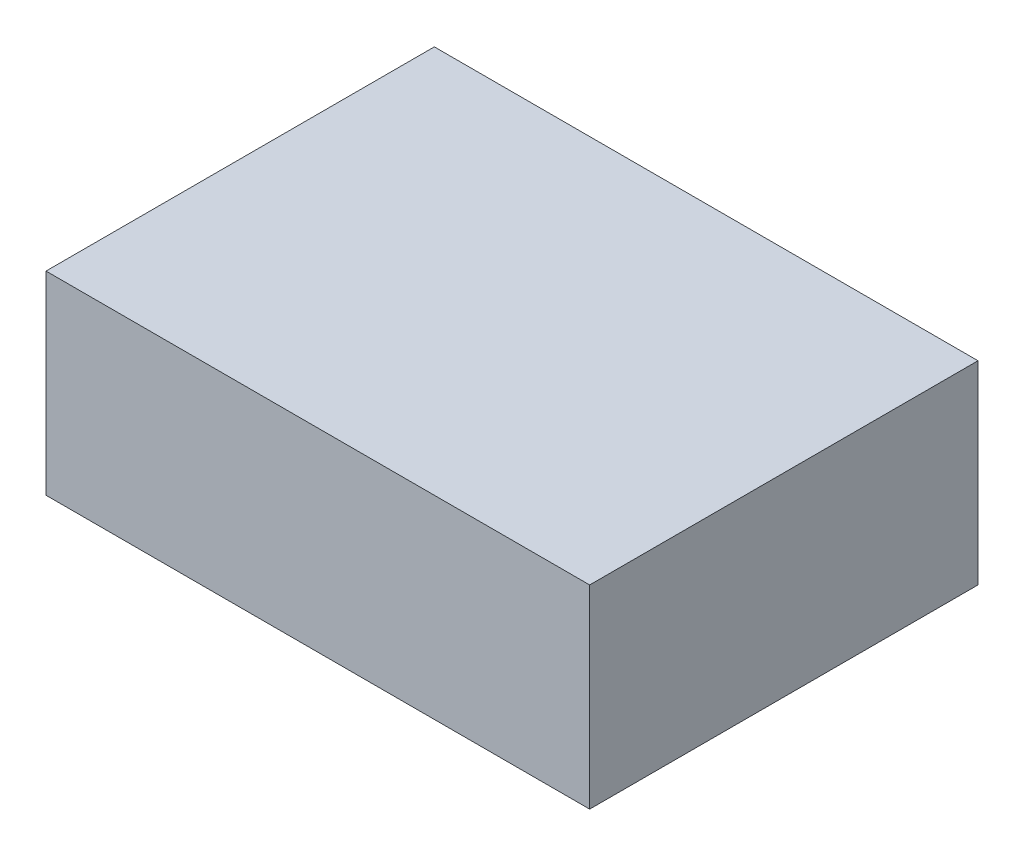
ISO-10303-21;
HEADER;
FILE_DESCRIPTION(('STEP AP214'),'2;1');
FILE_NAME('part.step','',(''),(''),'','','');
FILE_SCHEMA(('AUTOMOTIVE_DESIGN { 1 0 10303 214 1 1 1 1 }'));
ENDSEC;
DATA;
#1=APPLICATION_CONTEXT('core data for automotive mechanical design processes');
#2=APPLICATION_PROTOCOL_DEFINITION('international standard','automotive_design',2000,#1);
#3=PRODUCT_CONTEXT('',#1,'mechanical');
#4=PRODUCT('Part','Part','',(#3));
#5=PRODUCT_RELATED_PRODUCT_CATEGORY('part','',(#4));
#6=PRODUCT_DEFINITION_FORMATION('','',#4);
#7=PRODUCT_DEFINITION_CONTEXT('part definition',#1,'design');
#8=PRODUCT_DEFINITION('design','',#6,#7);
#9=PRODUCT_DEFINITION_SHAPE('','',#8);
#10=(LENGTH_UNIT() NAMED_UNIT(*) SI_UNIT(.MILLI.,.METRE.));
#11=(NAMED_UNIT(*) PLANE_ANGLE_UNIT() SI_UNIT($,.RADIAN.));
#12=(NAMED_UNIT(*) SI_UNIT($,.STERADIAN.) SOLID_ANGLE_UNIT());
#13=UNCERTAINTY_MEASURE_WITH_UNIT(LENGTH_MEASURE(1.E-05),#10,'distance_accuracy_value','');
#14=(GEOMETRIC_REPRESENTATION_CONTEXT(3) GLOBAL_UNCERTAINTY_ASSIGNED_CONTEXT((#13)) GLOBAL_UNIT_ASSIGNED_CONTEXT((#10,
#11,#12)) REPRESENTATION_CONTEXT('',''));
#15=CARTESIAN_POINT('',(0.,0.,0.));
#16=DIRECTION('',(0.,0.,1.));
#17=DIRECTION('',(1.,0.,0.));
#18=AXIS2_PLACEMENT_3D('',#15,#16,#17);
#19=CARTESIAN_POINT('',(127.,104.,-115.));
#20=DIRECTION('',(0.,1.,0.));
#21=DIRECTION('',(0.,0.,-1.));
#22=AXIS2_PLACEMENT_3D('',#19,#20,#21);
#23=PLANE('',#22);
#24=DIRECTION('',(1.,0.,0.));
#25=VECTOR('',#24,1.);
#26=CARTESIAN_POINT('',(92.,104.,-90.));
#27=LINE('',#26,#25);
#28=CARTESIAN_POINT('',(92.,104.,-90.));
#29=VERTEX_POINT('',#28);
#30=CARTESIAN_POINT('',(162.,104.,-90.));
#31=VERTEX_POINT('',#30);
#32=EDGE_CURVE('E89',#29,#31,#27,.T.);
#33=ORIENTED_EDGE('',*,*,#32,.T.);
#34=DIRECTION('',(0.,0.,-1.));
#35=VECTOR('',#34,1.);
#36=CARTESIAN_POINT('',(162.,104.,-90.));
#37=LINE('',#36,#35);
#38=CARTESIAN_POINT('',(162.,104.,-140.));
#39=VERTEX_POINT('',#38);
#40=EDGE_CURVE('E69',#31,#39,#37,.T.);
#41=ORIENTED_EDGE('',*,*,#40,.T.);
#42=DIRECTION('',(-1.,0.,0.));
#43=VECTOR('',#42,1.);
#44=CARTESIAN_POINT('',(162.,104.,-140.));
#45=LINE('',#44,#43);
#46=CARTESIAN_POINT('',(92.,104.,-140.));
#47=VERTEX_POINT('',#46);
#48=EDGE_CURVE('E74',#39,#47,#45,.T.);
#49=ORIENTED_EDGE('',*,*,#48,.T.);
#50=DIRECTION('',(0.,0.,1.));
#51=VECTOR('',#50,1.);
#52=CARTESIAN_POINT('',(92.,104.,-140.));
#53=LINE('',#52,#51);
#54=EDGE_CURVE('E11',#47,#29,#53,.T.);
#55=ORIENTED_EDGE('',*,*,#54,.T.);
#56=EDGE_LOOP('',(#33,#41,#49,#55));
#57=FACE_BOUND('',#56,.T.);
#58=ADVANCED_FACE('F17',(#57),#23,.T.);
#59=CARTESIAN_POINT('',(127.,79.,-115.));
#60=DIRECTION('',(0.,1.,0.));
#61=DIRECTION('',(0.,0.,-1.));
#62=AXIS2_PLACEMENT_3D('',#59,#60,#61);
#63=PLANE('',#62);
#64=DIRECTION('',(0.,0.,1.));
#65=VECTOR('',#64,1.);
#66=CARTESIAN_POINT('',(92.,79.,-140.));
#67=LINE('',#66,#65);
#68=CARTESIAN_POINT('',(92.,79.,-140.));
#69=VERTEX_POINT('',#68);
#70=CARTESIAN_POINT('',(92.,79.,-90.));
#71=VERTEX_POINT('',#70);
#72=EDGE_CURVE('E20',#69,#71,#67,.T.);
#73=ORIENTED_EDGE('',*,*,#72,.F.);
#74=DIRECTION('',(-1.,0.,0.));
#75=VECTOR('',#74,1.);
#76=CARTESIAN_POINT('',(162.,79.,-140.));
#77=LINE('',#76,#75);
#78=CARTESIAN_POINT('',(162.,79.,-140.));
#79=VERTEX_POINT('',#78);
#80=EDGE_CURVE('E56',#79,#69,#77,.T.);
#81=ORIENTED_EDGE('',*,*,#80,.F.);
#82=DIRECTION('',(0.,0.,-1.));
#83=VECTOR('',#82,1.);
#84=CARTESIAN_POINT('',(162.,79.,-90.));
#85=LINE('',#84,#83);
#86=CARTESIAN_POINT('',(162.,79.,-90.));
#87=VERTEX_POINT('',#86);
#88=EDGE_CURVE('E63',#87,#79,#85,.T.);
#89=ORIENTED_EDGE('',*,*,#88,.F.);
#90=DIRECTION('',(1.,0.,0.));
#91=VECTOR('',#90,1.);
#92=CARTESIAN_POINT('',(92.,79.,-90.));
#93=LINE('',#92,#91);
#94=EDGE_CURVE('E115',#71,#87,#93,.T.);
#95=ORIENTED_EDGE('',*,*,#94,.F.);
#96=EDGE_LOOP('',(#73,#81,#89,#95));
#97=FACE_BOUND('',#96,.T.);
#98=ADVANCED_FACE('F61',(#97),#63,.F.);
#99=CARTESIAN_POINT('',(92.,79.,-140.));
#100=DIRECTION('',(1.,0.,0.));
#101=DIRECTION('',(0.,1.,0.));
#102=AXIS2_PLACEMENT_3D('',#99,#100,#101);
#103=PLANE('',#102);
#104=ORIENTED_EDGE('',*,*,#72,.T.);
#105=DIRECTION('',(0.,1.,0.));
#106=VECTOR('',#105,1.);
#107=CARTESIAN_POINT('',(92.,79.,-90.));
#108=LINE('',#107,#106);
#109=EDGE_CURVE('E88',#71,#29,#108,.T.);
#110=ORIENTED_EDGE('',*,*,#109,.T.);
#111=ORIENTED_EDGE('',*,*,#54,.F.);
#112=DIRECTION('',(0.,1.,0.));
#113=VECTOR('',#112,1.);
#114=CARTESIAN_POINT('',(92.,79.,-140.));
#115=LINE('',#114,#113);
#116=EDGE_CURVE('E67',#69,#47,#115,.T.);
#117=ORIENTED_EDGE('',*,*,#116,.F.);
#118=EDGE_LOOP('',(#104,#110,#111,#117));
#119=FACE_BOUND('',#118,.T.);
#120=ADVANCED_FACE('F106',(#119),#103,.F.);
#121=CARTESIAN_POINT('',(162.,79.,-140.));
#122=DIRECTION('',(0.,0.,1.));
#123=DIRECTION('',(0.,-1.,0.));
#124=AXIS2_PLACEMENT_3D('',#121,#122,#123);
#125=PLANE('',#124);
#126=ORIENTED_EDGE('',*,*,#80,.T.);
#127=ORIENTED_EDGE('',*,*,#116,.T.);
#128=ORIENTED_EDGE('',*,*,#48,.F.);
#129=DIRECTION('',(0.,1.,0.));
#130=VECTOR('',#129,1.);
#131=CARTESIAN_POINT('',(162.,79.,-140.));
#132=LINE('',#131,#130);
#133=EDGE_CURVE('E73',#79,#39,#132,.T.);
#134=ORIENTED_EDGE('',*,*,#133,.F.);
#135=EDGE_LOOP('',(#126,#127,#128,#134));
#136=FACE_BOUND('',#135,.T.);
#137=ADVANCED_FACE('F72',(#136),#125,.F.);
#138=CARTESIAN_POINT('',(162.,79.,-90.));
#139=DIRECTION('',(-1.,0.,0.));
#140=DIRECTION('',(0.,0.,1.));
#141=AXIS2_PLACEMENT_3D('',#138,#139,#140);
#142=PLANE('',#141);
#143=ORIENTED_EDGE('',*,*,#88,.T.);
#144=ORIENTED_EDGE('',*,*,#133,.T.);
#145=ORIENTED_EDGE('',*,*,#40,.F.);
#146=DIRECTION('',(0.,1.,0.));
#147=VECTOR('',#146,1.);
#148=CARTESIAN_POINT('',(162.,79.,-90.));
#149=LINE('',#148,#147);
#150=EDGE_CURVE('E83',#87,#31,#149,.T.);
#151=ORIENTED_EDGE('',*,*,#150,.F.);
#152=EDGE_LOOP('',(#143,#144,#145,#151));
#153=FACE_BOUND('',#152,.T.);
#154=ADVANCED_FACE('F81',(#153),#142,.F.);
#155=CARTESIAN_POINT('',(92.,79.,-90.));
#156=DIRECTION('',(0.,0.,-1.));
#157=DIRECTION('',(-1.,0.,0.));
#158=AXIS2_PLACEMENT_3D('',#155,#156,#157);
#159=PLANE('',#158);
#160=ORIENTED_EDGE('',*,*,#94,.T.);
#161=ORIENTED_EDGE('',*,*,#150,.T.);
#162=ORIENTED_EDGE('',*,*,#32,.F.);
#163=ORIENTED_EDGE('',*,*,#109,.F.);
#164=EDGE_LOOP('',(#160,#161,#162,#163));
#165=FACE_BOUND('',#164,.T.);
#166=ADVANCED_FACE('F112',(#165),#159,.F.);
#167=CLOSED_SHELL('',(#58,#98,#120,#137,#154,#166));
#168=MANIFOLD_SOLID_BREP('B1',#167);
#169=ADVANCED_BREP_SHAPE_REPRESENTATION('',(#18,#168),#14);
#170=SHAPE_DEFINITION_REPRESENTATION(#9,#169);
ENDSEC;
END-ISO-10303-21;
